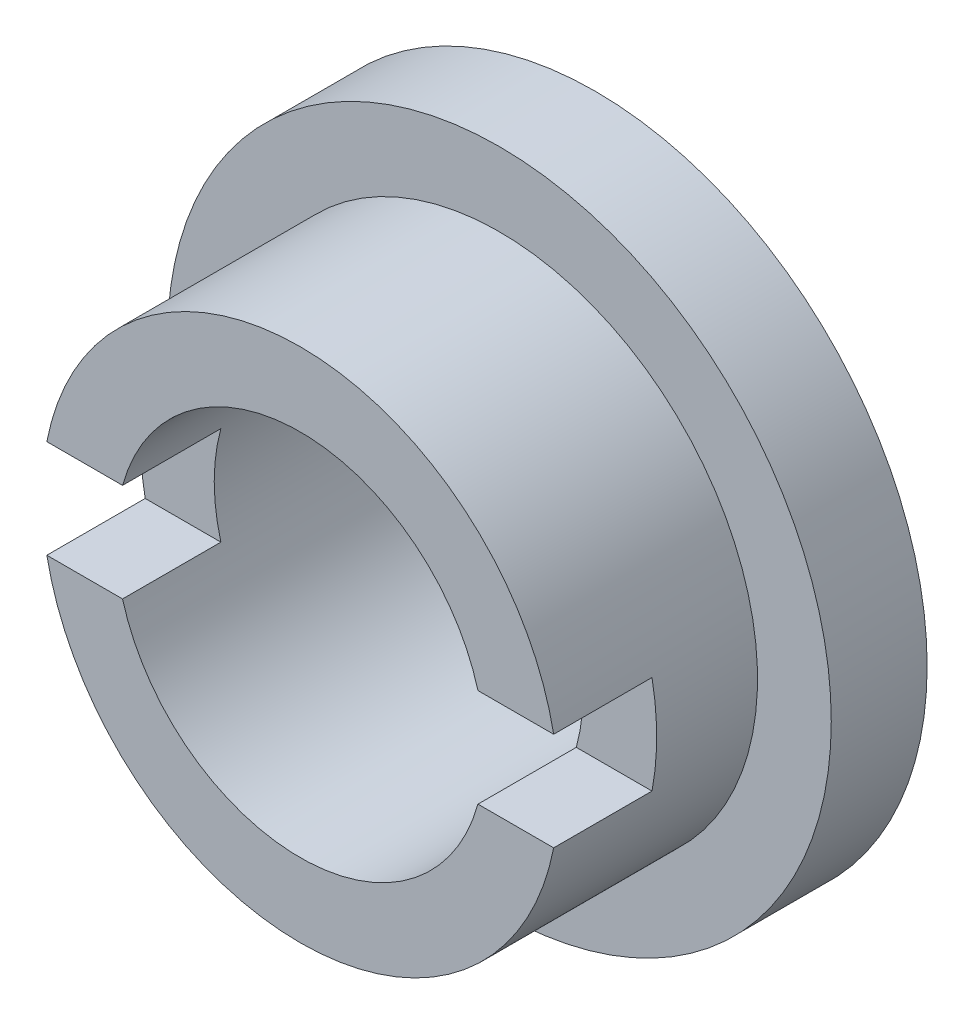
ISO-10303-21;
HEADER;
FILE_DESCRIPTION(('STEP AP214'),'2;1');
FILE_NAME('part.step','',(''),(''),'','','');
FILE_SCHEMA(('AUTOMOTIVE_DESIGN { 1 0 10303 214 1 1 1 1 }'));
ENDSEC;
DATA;
#1=APPLICATION_CONTEXT('core data for automotive mechanical design processes');
#2=APPLICATION_PROTOCOL_DEFINITION('international standard','automotive_design',2000,#1);
#3=PRODUCT_CONTEXT('',#1,'mechanical');
#4=PRODUCT('Part','Part','',(#3));
#5=PRODUCT_RELATED_PRODUCT_CATEGORY('part','',(#4));
#6=PRODUCT_DEFINITION_FORMATION('','',#4);
#7=PRODUCT_DEFINITION_CONTEXT('part definition',#1,'design');
#8=PRODUCT_DEFINITION('design','',#6,#7);
#9=PRODUCT_DEFINITION_SHAPE('','',#8);
#10=(LENGTH_UNIT() NAMED_UNIT(*) SI_UNIT(.MILLI.,.METRE.));
#11=(NAMED_UNIT(*) PLANE_ANGLE_UNIT() SI_UNIT($,.RADIAN.));
#12=(NAMED_UNIT(*) SI_UNIT($,.STERADIAN.) SOLID_ANGLE_UNIT());
#13=UNCERTAINTY_MEASURE_WITH_UNIT(LENGTH_MEASURE(1.E-05),#10,'distance_accuracy_value','');
#14=(GEOMETRIC_REPRESENTATION_CONTEXT(3) GLOBAL_UNCERTAINTY_ASSIGNED_CONTEXT((#13)) GLOBAL_UNIT_ASSIGNED_CONTEXT((#10,
#11,#12)) REPRESENTATION_CONTEXT('',''));
#15=CARTESIAN_POINT('',(0.,0.,0.));
#16=DIRECTION('',(0.,0.,1.));
#17=DIRECTION('',(1.,0.,0.));
#18=AXIS2_PLACEMENT_3D('',#15,#16,#17);
#19=CARTESIAN_POINT('',(0.,0.,12.));
#20=DIRECTION('',(0.,0.,1.));
#21=DIRECTION('',(1.,0.,0.));
#22=AXIS2_PLACEMENT_3D('',#19,#20,#21);
#23=PLANE('',#22);
#24=DIRECTION('',(1.,0.,0.));
#25=VECTOR('',#24,1.);
#26=CARTESIAN_POINT('',(-12.9647525548108,-2.,12.));
#27=LINE('',#26,#25);
#28=CARTESIAN_POINT('',(-10.3077640640442,-2.,12.));
#29=VERTEX_POINT('',#28);
#30=CARTESIAN_POINT('',(-7.22841614740048,-2.,12.));
#31=VERTEX_POINT('',#30);
#32=EDGE_CURVE('E173',#29,#31,#27,.T.);
#33=ORIENTED_EDGE('',*,*,#32,.F.);
#34=CARTESIAN_POINT('',(0.,0.,12.));
#35=DIRECTION('',(0.,0.,1.));
#36=DIRECTION('',(1.,0.,0.));
#37=AXIS2_PLACEMENT_3D('',#34,#35,#36);
#38=CIRCLE('',#37,10.5);
#39=CARTESIAN_POINT('',(10.3077640640441,-2.,12.));
#40=VERTEX_POINT('',#39);
#41=EDGE_CURVE('E143',#29,#40,#38,.T.);
#42=ORIENTED_EDGE('',*,*,#41,.T.);
#43=CARTESIAN_POINT('',(7.22841614740048,-2.,12.));
#44=VERTEX_POINT('',#43);
#45=EDGE_CURVE('E135',#44,#40,#27,.T.);
#46=ORIENTED_EDGE('',*,*,#45,.F.);
#47=CARTESIAN_POINT('',(0.,0.,12.));
#48=DIRECTION('',(0.,0.,1.));
#49=DIRECTION('',(1.,0.,0.));
#50=AXIS2_PLACEMENT_3D('',#47,#48,#49);
#51=CIRCLE('',#50,7.5);
#52=EDGE_CURVE('E194',#31,#44,#51,.T.);
#53=ORIENTED_EDGE('',*,*,#52,.F.);
#54=EDGE_LOOP('',(#33,#42,#46,#53));
#55=FACE_BOUND('',#54,.T.);
#56=ADVANCED_FACE('F53',(#55),#23,.T.);
#57=CARTESIAN_POINT('',(0.,0.,12.));
#58=DIRECTION('',(0.,0.,-1.));
#59=DIRECTION('',(-1.,0.,0.));
#60=AXIS2_PLACEMENT_3D('',#57,#58,#59);
#61=CYLINDRICAL_SURFACE('',#60,10.5);
#62=ORIENTED_EDGE('',*,*,#41,.F.);
#63=DIRECTION('',(0.,0.,-1.));
#64=VECTOR('',#63,1.);
#65=CARTESIAN_POINT('',(-10.3077640640442,-2.,12.));
#66=LINE('',#65,#64);
#67=CARTESIAN_POINT('',(-10.3077640640441,-2.,8.));
#68=VERTEX_POINT('',#67);
#69=EDGE_CURVE('E186',#29,#68,#66,.T.);
#70=ORIENTED_EDGE('',*,*,#69,.T.);
#71=CARTESIAN_POINT('',(0.,0.,8.));
#72=DIRECTION('',(0.,0.,1.));
#73=DIRECTION('',(1.,0.,0.));
#74=AXIS2_PLACEMENT_3D('',#71,#72,#73);
#75=CIRCLE('',#74,10.5);
#76=CARTESIAN_POINT('',(-10.3077640640441,2.,8.));
#77=VERTEX_POINT('',#76);
#78=EDGE_CURVE('E182',#77,#68,#75,.T.);
#79=ORIENTED_EDGE('',*,*,#78,.F.);
#80=DIRECTION('',(0.,0.,-1.));
#81=VECTOR('',#80,1.);
#82=CARTESIAN_POINT('',(-10.3077640640442,2.,12.));
#83=LINE('',#82,#81);
#84=CARTESIAN_POINT('',(-10.3077640640442,2.,12.));
#85=VERTEX_POINT('',#84);
#86=EDGE_CURVE('E125',#77,#85,#83,.F.);
#87=ORIENTED_EDGE('',*,*,#86,.T.);
#88=CARTESIAN_POINT('',(10.3077640640441,2.,12.));
#89=VERTEX_POINT('',#88);
#90=EDGE_CURVE('E132',#89,#85,#38,.T.);
#91=ORIENTED_EDGE('',*,*,#90,.F.);
#92=DIRECTION('',(0.,0.,-1.));
#93=VECTOR('',#92,1.);
#94=CARTESIAN_POINT('',(10.3077640640442,2.,12.));
#95=LINE('',#94,#93);
#96=CARTESIAN_POINT('',(10.3077640640441,2.,8.));
#97=VERTEX_POINT('',#96);
#98=EDGE_CURVE('E116',#89,#97,#95,.T.);
#99=ORIENTED_EDGE('',*,*,#98,.T.);
#100=CARTESIAN_POINT('',(10.3077640640441,-2.,8.));
#101=VERTEX_POINT('',#100);
#102=EDGE_CURVE('E180',#101,#97,#75,.T.);
#103=ORIENTED_EDGE('',*,*,#102,.F.);
#104=DIRECTION('',(0.,0.,-1.));
#105=VECTOR('',#104,1.);
#106=CARTESIAN_POINT('',(10.3077640640442,-2.,12.));
#107=LINE('',#106,#105);
#108=EDGE_CURVE('E124',#101,#40,#107,.F.);
#109=ORIENTED_EDGE('',*,*,#108,.T.);
#110=EDGE_LOOP('',(#62,#70,#79,#87,#91,#99,#103,#109));
#111=FACE_BOUND('',#110,.T.);
#112=CARTESIAN_POINT('',(0.,0.,3.9));
#113=DIRECTION('',(0.,0.,-1.));
#114=DIRECTION('',(-1.,0.,0.));
#115=AXIS2_PLACEMENT_3D('',#112,#113,#114);
#116=CIRCLE('',#115,10.5);
#117=CARTESIAN_POINT('',(-10.5,0.,3.9));
#118=VERTEX_POINT('',#117);
#119=EDGE_CURVE('E142',#118,#118,#116,.T.);
#120=ORIENTED_EDGE('',*,*,#119,.F.);
#121=EDGE_LOOP('',(#120));
#122=FACE_BOUND('',#121,.T.);
#123=ADVANCED_FACE('F55',(#111,#122),#61,.T.);
#124=DIRECTION('',(-1.,0.,0.));
#125=VECTOR('',#124,1.);
#126=CARTESIAN_POINT('',(-12.9647525548108,2.,12.));
#127=LINE('',#126,#125);
#128=CARTESIAN_POINT('',(7.22841614740048,2.,12.));
#129=VERTEX_POINT('',#128);
#130=EDGE_CURVE('E119',#89,#129,#127,.T.);
#131=ORIENTED_EDGE('',*,*,#130,.F.);
#132=ORIENTED_EDGE('',*,*,#90,.T.);
#133=CARTESIAN_POINT('',(-7.22841614740048,2.,12.));
#134=VERTEX_POINT('',#133);
#135=EDGE_CURVE('E136',#134,#85,#127,.T.);
#136=ORIENTED_EDGE('',*,*,#135,.F.);
#137=EDGE_CURVE('E134',#129,#134,#51,.T.);
#138=ORIENTED_EDGE('',*,*,#137,.F.);
#139=EDGE_LOOP('',(#131,#132,#136,#138));
#140=FACE_BOUND('',#139,.T.);
#141=ADVANCED_FACE('F130',(#140),#23,.T.);
#142=CARTESIAN_POINT('',(0.,0.,0.));
#143=DIRECTION('',(0.,0.,1.));
#144=DIRECTION('',(1.,0.,0.));
#145=AXIS2_PLACEMENT_3D('',#142,#143,#144);
#146=PLANE('',#145);
#147=CARTESIAN_POINT('',(0.,0.,0.));
#148=DIRECTION('',(0.,0.,1.));
#149=DIRECTION('',(1.,0.,0.));
#150=AXIS2_PLACEMENT_3D('',#147,#148,#149);
#151=CIRCLE('',#150,7.5);
#152=CARTESIAN_POINT('',(7.5,0.,0.));
#153=VERTEX_POINT('',#152);
#154=EDGE_CURVE('E150',#153,#153,#151,.T.);
#155=ORIENTED_EDGE('',*,*,#154,.T.);
#156=EDGE_LOOP('',(#155));
#157=FACE_BOUND('',#156,.T.);
#158=CARTESIAN_POINT('',(0.,0.,0.));
#159=DIRECTION('',(0.,0.,-1.));
#160=DIRECTION('',(-1.,0.,0.));
#161=AXIS2_PLACEMENT_3D('',#158,#159,#160);
#162=CIRCLE('',#161,13.5);
#163=CARTESIAN_POINT('',(-13.5,0.,0.));
#164=VERTEX_POINT('',#163);
#165=EDGE_CURVE('E189',#164,#164,#162,.T.);
#166=ORIENTED_EDGE('',*,*,#165,.T.);
#167=EDGE_LOOP('',(#166));
#168=FACE_BOUND('',#167,.T.);
#169=ADVANCED_FACE('F199',(#157,#168),#146,.F.);
#170=CARTESIAN_POINT('',(0.,0.,12.));
#171=DIRECTION('',(0.,0.,-1.));
#172=DIRECTION('',(-1.,0.,0.));
#173=AXIS2_PLACEMENT_3D('',#170,#171,#172);
#174=CYLINDRICAL_SURFACE('',#173,7.5);
#175=DIRECTION('',(0.,0.,-1.));
#176=VECTOR('',#175,1.);
#177=CARTESIAN_POINT('',(-7.22841614740048,-2.,12.));
#178=LINE('',#177,#176);
#179=CARTESIAN_POINT('',(-7.22841614740048,-2.,8.));
#180=VERTEX_POINT('',#179);
#181=EDGE_CURVE('E12',#31,#180,#178,.T.);
#182=ORIENTED_EDGE('',*,*,#181,.F.);
#183=ORIENTED_EDGE('',*,*,#52,.T.);
#184=DIRECTION('',(0.,0.,-1.));
#185=VECTOR('',#184,1.);
#186=CARTESIAN_POINT('',(7.22841614740048,-2.,12.));
#187=LINE('',#186,#185);
#188=CARTESIAN_POINT('',(7.22841614740048,-2.,8.));
#189=VERTEX_POINT('',#188);
#190=EDGE_CURVE('E158',#189,#44,#187,.F.);
#191=ORIENTED_EDGE('',*,*,#190,.F.);
#192=CARTESIAN_POINT('',(0.,0.,8.));
#193=DIRECTION('',(0.,0.,1.));
#194=DIRECTION('',(1.,0.,0.));
#195=AXIS2_PLACEMENT_3D('',#192,#193,#194);
#196=CIRCLE('',#195,7.5);
#197=CARTESIAN_POINT('',(7.22841614740048,2.,8.));
#198=VERTEX_POINT('',#197);
#199=EDGE_CURVE('E146',#189,#198,#196,.T.);
#200=ORIENTED_EDGE('',*,*,#199,.T.);
#201=DIRECTION('',(0.,0.,-1.));
#202=VECTOR('',#201,1.);
#203=CARTESIAN_POINT('',(7.22841614740048,2.,12.));
#204=LINE('',#203,#202);
#205=EDGE_CURVE('E155',#129,#198,#204,.T.);
#206=ORIENTED_EDGE('',*,*,#205,.F.);
#207=ORIENTED_EDGE('',*,*,#137,.T.);
#208=DIRECTION('',(0.,0.,-1.));
#209=VECTOR('',#208,1.);
#210=CARTESIAN_POINT('',(-7.22841614740048,2.,12.));
#211=LINE('',#210,#209);
#212=CARTESIAN_POINT('',(-7.22841614740048,2.,8.));
#213=VERTEX_POINT('',#212);
#214=EDGE_CURVE('E61',#213,#134,#211,.F.);
#215=ORIENTED_EDGE('',*,*,#214,.F.);
#216=EDGE_CURVE('E156',#213,#180,#196,.T.);
#217=ORIENTED_EDGE('',*,*,#216,.T.);
#218=EDGE_LOOP('',(#182,#183,#191,#200,#206,#207,#215,#217));
#219=FACE_BOUND('',#218,.T.);
#220=ORIENTED_EDGE('',*,*,#154,.F.);
#221=EDGE_LOOP('',(#220));
#222=FACE_BOUND('',#221,.T.);
#223=ADVANCED_FACE('F165',(#219,#222),#174,.F.);
#224=CARTESIAN_POINT('',(0.,0.,3.9));
#225=DIRECTION('',(0.,0.,-1.));
#226=DIRECTION('',(-1.,0.,0.));
#227=AXIS2_PLACEMENT_3D('',#224,#225,#226);
#228=CYLINDRICAL_SURFACE('',#227,13.5);
#229=CARTESIAN_POINT('',(0.,0.,3.9));
#230=DIRECTION('',(0.,0.,-1.));
#231=DIRECTION('',(-1.,0.,0.));
#232=AXIS2_PLACEMENT_3D('',#229,#230,#231);
#233=CIRCLE('',#232,13.5);
#234=CARTESIAN_POINT('',(-13.5,0.,3.9));
#235=VERTEX_POINT('',#234);
#236=EDGE_CURVE('E190',#235,#235,#233,.T.);
#237=ORIENTED_EDGE('',*,*,#236,.T.);
#238=EDGE_LOOP('',(#237));
#239=FACE_BOUND('',#238,.T.);
#240=ORIENTED_EDGE('',*,*,#165,.F.);
#241=EDGE_LOOP('',(#240));
#242=FACE_BOUND('',#241,.T.);
#243=ADVANCED_FACE('F202',(#239,#242),#228,.T.);
#244=CARTESIAN_POINT('',(0.,0.,3.9));
#245=DIRECTION('',(0.,0.,-1.));
#246=DIRECTION('',(-1.,0.,0.));
#247=AXIS2_PLACEMENT_3D('',#244,#245,#246);
#248=PLANE('',#247);
#249=ORIENTED_EDGE('',*,*,#119,.T.);
#250=EDGE_LOOP('',(#249));
#251=FACE_BOUND('',#250,.T.);
#252=ORIENTED_EDGE('',*,*,#236,.F.);
#253=EDGE_LOOP('',(#252));
#254=FACE_BOUND('',#253,.T.);
#255=ADVANCED_FACE('F209',(#251,#254),#248,.F.);
#256=CARTESIAN_POINT('',(0.,0.,8.));
#257=DIRECTION('',(0.,0.,1.));
#258=DIRECTION('',(1.,0.,0.));
#259=AXIS2_PLACEMENT_3D('',#256,#257,#258);
#260=PLANE('',#259);
#261=ORIENTED_EDGE('',*,*,#102,.T.);
#262=DIRECTION('',(-1.,0.,0.));
#263=VECTOR('',#262,1.);
#264=CARTESIAN_POINT('',(-12.9647525548108,2.,8.));
#265=LINE('',#264,#263);
#266=EDGE_CURVE('E75',#97,#198,#265,.T.);
#267=ORIENTED_EDGE('',*,*,#266,.T.);
#268=ORIENTED_EDGE('',*,*,#199,.F.);
#269=DIRECTION('',(1.,0.,0.));
#270=VECTOR('',#269,1.);
#271=CARTESIAN_POINT('',(-12.9647525548108,-2.,8.));
#272=LINE('',#271,#270);
#273=EDGE_CURVE('E175',#189,#101,#272,.T.);
#274=ORIENTED_EDGE('',*,*,#273,.T.);
#275=EDGE_LOOP('',(#261,#267,#268,#274));
#276=FACE_BOUND('',#275,.T.);
#277=ADVANCED_FACE('F245',(#276),#260,.T.);
#278=CARTESIAN_POINT('',(-12.9647525548108,2.,8.));
#279=DIRECTION('',(0.,1.,0.));
#280=DIRECTION('',(0.,0.,1.));
#281=AXIS2_PLACEMENT_3D('',#278,#279,#280);
#282=PLANE('',#281);
#283=ORIENTED_EDGE('',*,*,#130,.T.);
#284=ORIENTED_EDGE('',*,*,#205,.T.);
#285=ORIENTED_EDGE('',*,*,#266,.F.);
#286=ORIENTED_EDGE('',*,*,#98,.F.);
#287=EDGE_LOOP('',(#283,#284,#285,#286));
#288=FACE_BOUND('',#287,.T.);
#289=ADVANCED_FACE('F118',(#288),#282,.F.);
#290=CARTESIAN_POINT('',(-12.9647525548108,-2.,8.));
#291=DIRECTION('',(0.,-1.,0.));
#292=DIRECTION('',(0.,0.,-1.));
#293=AXIS2_PLACEMENT_3D('',#290,#291,#292);
#294=PLANE('',#293);
#295=ORIENTED_EDGE('',*,*,#273,.F.);
#296=ORIENTED_EDGE('',*,*,#190,.T.);
#297=ORIENTED_EDGE('',*,*,#45,.T.);
#298=ORIENTED_EDGE('',*,*,#108,.F.);
#299=EDGE_LOOP('',(#295,#296,#297,#298));
#300=FACE_BOUND('',#299,.T.);
#301=ADVANCED_FACE('F265',(#300),#294,.F.);
#302=ORIENTED_EDGE('',*,*,#32,.T.);
#303=ORIENTED_EDGE('',*,*,#181,.T.);
#304=EDGE_CURVE('E68',#68,#180,#272,.T.);
#305=ORIENTED_EDGE('',*,*,#304,.F.);
#306=ORIENTED_EDGE('',*,*,#69,.F.);
#307=EDGE_LOOP('',(#302,#303,#305,#306));
#308=FACE_BOUND('',#307,.T.);
#309=ADVANCED_FACE('F273',(#308),#294,.F.);
#310=EDGE_CURVE('E171',#213,#77,#265,.T.);
#311=ORIENTED_EDGE('',*,*,#310,.F.);
#312=ORIENTED_EDGE('',*,*,#214,.T.);
#313=ORIENTED_EDGE('',*,*,#135,.T.);
#314=ORIENTED_EDGE('',*,*,#86,.F.);
#315=EDGE_LOOP('',(#311,#312,#313,#314));
#316=FACE_BOUND('',#315,.T.);
#317=ADVANCED_FACE('F172',(#316),#282,.F.);
#318=ORIENTED_EDGE('',*,*,#78,.T.);
#319=ORIENTED_EDGE('',*,*,#304,.T.);
#320=ORIENTED_EDGE('',*,*,#216,.F.);
#321=ORIENTED_EDGE('',*,*,#310,.T.);
#322=EDGE_LOOP('',(#318,#319,#320,#321));
#323=FACE_BOUND('',#322,.T.);
#324=ADVANCED_FACE('F170',(#323),#260,.T.);
#325=CLOSED_SHELL('',(#56,#123,#141,#169,#223,#243,#255,#277,#289,#301,#309,#317,#324));
#326=MANIFOLD_SOLID_BREP('B2',#325);
#327=ADVANCED_BREP_SHAPE_REPRESENTATION('',(#18,#326),#14);
#328=SHAPE_DEFINITION_REPRESENTATION(#9,#327);
ENDSEC;
END-ISO-10303-21;
